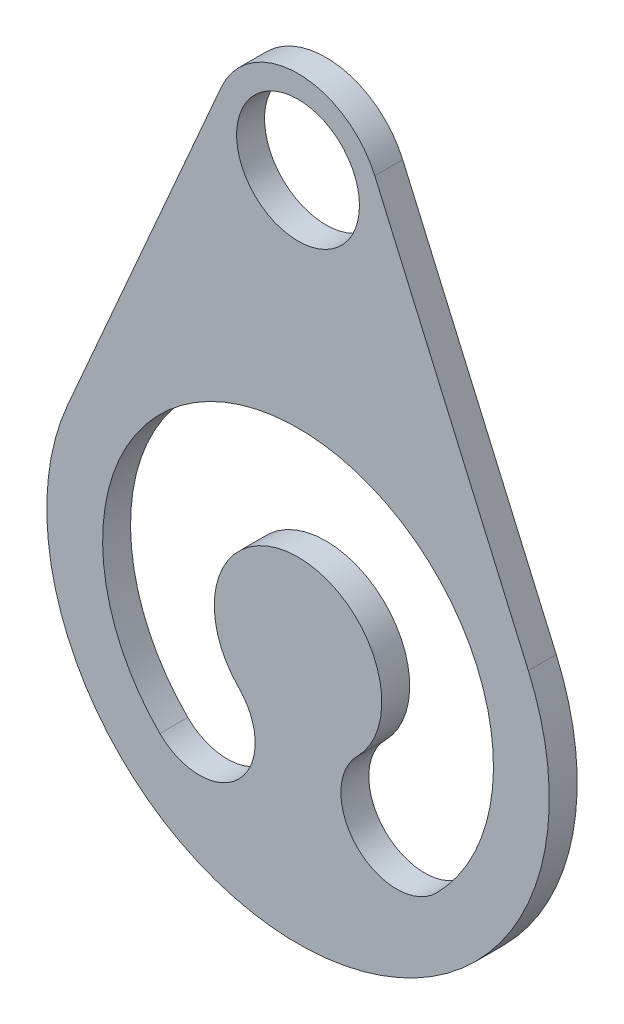
ISO-10303-21;
HEADER;
FILE_DESCRIPTION(('STEP AP214'),'2;1');
FILE_NAME('part.step','',(''),(''),'','','');
FILE_SCHEMA(('AUTOMOTIVE_DESIGN { 1 0 10303 214 1 1 1 1 }'));
ENDSEC;
DATA;
#1=APPLICATION_CONTEXT('core data for automotive mechanical design processes');
#2=APPLICATION_PROTOCOL_DEFINITION('international standard','automotive_design',2000,#1);
#3=PRODUCT_CONTEXT('',#1,'mechanical');
#4=PRODUCT('Part','Part','',(#3));
#5=PRODUCT_RELATED_PRODUCT_CATEGORY('part','',(#4));
#6=PRODUCT_DEFINITION_FORMATION('','',#4);
#7=PRODUCT_DEFINITION_CONTEXT('part definition',#1,'design');
#8=PRODUCT_DEFINITION('design','',#6,#7);
#9=PRODUCT_DEFINITION_SHAPE('','',#8);
#10=(LENGTH_UNIT() NAMED_UNIT(*) SI_UNIT(.MILLI.,.METRE.));
#11=(NAMED_UNIT(*) PLANE_ANGLE_UNIT() SI_UNIT($,.RADIAN.));
#12=(NAMED_UNIT(*) SI_UNIT($,.STERADIAN.) SOLID_ANGLE_UNIT());
#13=UNCERTAINTY_MEASURE_WITH_UNIT(LENGTH_MEASURE(1.E-05),#10,'distance_accuracy_value','');
#14=(GEOMETRIC_REPRESENTATION_CONTEXT(3) GLOBAL_UNCERTAINTY_ASSIGNED_CONTEXT((#13)) GLOBAL_UNIT_ASSIGNED_CONTEXT((#10,
#11,#12)) REPRESENTATION_CONTEXT('',''));
#15=CARTESIAN_POINT('',(0.,0.,0.));
#16=DIRECTION('',(0.,0.,1.));
#17=DIRECTION('',(1.,0.,0.));
#18=AXIS2_PLACEMENT_3D('',#15,#16,#17);
#19=CARTESIAN_POINT('',(0.,75.,5.));
#20=DIRECTION('',(0.,0.,1.));
#21=DIRECTION('',(1.,0.,0.));
#22=AXIS2_PLACEMENT_3D('',#19,#20,#21);
#23=PLANE('',#22);
#24=CARTESIAN_POINT('',(0.,0.,5.));
#25=DIRECTION('',(0.,0.,1.));
#26=DIRECTION('',(1.,0.,0.));
#27=AXIS2_PLACEMENT_3D('',#24,#25,#26);
#28=CIRCLE('',#27,35.);
#29=CARTESIAN_POINT('',(24.7487373415292,-24.7487373415292,5.));
#30=VERTEX_POINT('',#29);
#31=CARTESIAN_POINT('',(-24.7487373415291,-24.7487373415292,5.));
#32=VERTEX_POINT('',#31);
#33=EDGE_CURVE('E106',#30,#32,#28,.T.);
#34=ORIENTED_EDGE('',*,*,#33,.F.);
#35=CARTESIAN_POINT('',(17.6776695296637,-17.6776695296637,5.));
#36=DIRECTION('',(0.,0.,1.));
#37=DIRECTION('',(1.,0.,0.));
#38=AXIS2_PLACEMENT_3D('',#35,#36,#37);
#39=CIRCLE('',#38,10.);
#40=CARTESIAN_POINT('',(10.6066017177982,-10.6066017177982,5.));
#41=VERTEX_POINT('',#40);
#42=EDGE_CURVE('E98',#41,#30,#39,.T.);
#43=ORIENTED_EDGE('',*,*,#42,.F.);
#44=CARTESIAN_POINT('',(0.,0.,5.));
#45=DIRECTION('',(0.,0.,-1.));
#46=DIRECTION('',(1.,0.,0.));
#47=AXIS2_PLACEMENT_3D('',#44,#45,#46);
#48=CIRCLE('',#47,15.);
#49=CARTESIAN_POINT('',(-10.6066017177982,-10.6066017177982,5.));
#50=VERTEX_POINT('',#49);
#51=EDGE_CURVE('E121',#50,#41,#48,.T.);
#52=ORIENTED_EDGE('',*,*,#51,.F.);
#53=CARTESIAN_POINT('',(-17.6776695296637,-17.6776695296637,5.));
#54=DIRECTION('',(0.,0.,1.));
#55=DIRECTION('',(1.,0.,0.));
#56=AXIS2_PLACEMENT_3D('',#53,#54,#55);
#57=CIRCLE('',#56,10.);
#58=EDGE_CURVE('E119',#32,#50,#57,.T.);
#59=ORIENTED_EDGE('',*,*,#58,.F.);
#60=EDGE_LOOP('',(#34,#43,#52,#59));
#61=FACE_BOUND('',#60,.T.);
#62=CARTESIAN_POINT('',(0.,75.,5.));
#63=DIRECTION('',(0.,0.,1.));
#64=DIRECTION('',(1.,0.,0.));
#65=AXIS2_PLACEMENT_3D('',#62,#63,#64);
#66=CIRCLE('',#65,15.);
#67=CARTESIAN_POINT('',(13.7477270848675,81.,5.));
#68=VERTEX_POINT('',#67);
#69=CARTESIAN_POINT('',(-13.7477270848675,81.,5.));
#70=VERTEX_POINT('',#69);
#71=EDGE_CURVE('E137',#68,#70,#66,.T.);
#72=ORIENTED_EDGE('',*,*,#71,.T.);
#73=DIRECTION('',(-0.4,-0.916515138991168,0.));
#74=VECTOR('',#73,1.);
#75=CARTESIAN_POINT('',(-13.7477270848675,81.,5.));
#76=LINE('',#75,#74);
#77=CARTESIAN_POINT('',(-41.2431812546026,18.,5.));
#78=VERTEX_POINT('',#77);
#79=EDGE_CURVE('E140',#70,#78,#76,.T.);
#80=ORIENTED_EDGE('',*,*,#79,.T.);
#81=CARTESIAN_POINT('',(0.,0.,5.));
#82=DIRECTION('',(0.,0.,1.));
#83=DIRECTION('',(1.,0.,0.));
#84=AXIS2_PLACEMENT_3D('',#81,#82,#83);
#85=CIRCLE('',#84,45.);
#86=CARTESIAN_POINT('',(41.2431812546026,18.,5.));
#87=VERTEX_POINT('',#86);
#88=EDGE_CURVE('E143',#78,#87,#85,.T.);
#89=ORIENTED_EDGE('',*,*,#88,.T.);
#90=DIRECTION('',(-0.4,0.916515138991168,0.));
#91=VECTOR('',#90,1.);
#92=CARTESIAN_POINT('',(13.7477270848675,81.,5.));
#93=LINE('',#92,#91);
#94=EDGE_CURVE('E145',#87,#68,#93,.T.);
#95=ORIENTED_EDGE('',*,*,#94,.T.);
#96=EDGE_LOOP('',(#72,#80,#89,#95));
#97=FACE_BOUND('',#96,.T.);
#98=CARTESIAN_POINT('',(0.,75.,5.));
#99=DIRECTION('',(0.,0.,1.));
#100=DIRECTION('',(1.,0.,0.));
#101=AXIS2_PLACEMENT_3D('',#98,#99,#100);
#102=CIRCLE('',#101,11.);
#103=CARTESIAN_POINT('',(11.,75.,5.));
#104=VERTEX_POINT('',#103);
#105=EDGE_CURVE('E127',#104,#104,#102,.T.);
#106=ORIENTED_EDGE('',*,*,#105,.F.);
#107=EDGE_LOOP('',(#106));
#108=FACE_BOUND('',#107,.T.);
#109=ADVANCED_FACE('F33',(#61,#97,#108),#23,.T.);
#110=CARTESIAN_POINT('',(0.,75.,0.));
#111=DIRECTION('',(0.,0.,1.));
#112=DIRECTION('',(1.,0.,0.));
#113=AXIS2_PLACEMENT_3D('',#110,#111,#112);
#114=PLANE('',#113);
#115=CARTESIAN_POINT('',(0.,75.,0.));
#116=DIRECTION('',(0.,0.,1.));
#117=DIRECTION('',(1.,0.,0.));
#118=AXIS2_PLACEMENT_3D('',#115,#116,#117);
#119=CIRCLE('',#118,15.);
#120=CARTESIAN_POINT('',(13.7477270848675,81.,0.));
#121=VERTEX_POINT('',#120);
#122=CARTESIAN_POINT('',(-13.7477270848675,81.,0.));
#123=VERTEX_POINT('',#122);
#124=EDGE_CURVE('E114',#121,#123,#119,.T.);
#125=ORIENTED_EDGE('',*,*,#124,.F.);
#126=DIRECTION('',(-0.4,0.916515138991168,0.));
#127=VECTOR('',#126,1.);
#128=CARTESIAN_POINT('',(13.7477270848675,81.,0.));
#129=LINE('',#128,#127);
#130=CARTESIAN_POINT('',(41.2431812546026,18.,0.));
#131=VERTEX_POINT('',#130);
#132=EDGE_CURVE('E141',#131,#121,#129,.T.);
#133=ORIENTED_EDGE('',*,*,#132,.F.);
#134=CARTESIAN_POINT('',(0.,0.,0.));
#135=DIRECTION('',(0.,0.,1.));
#136=DIRECTION('',(1.,0.,0.));
#137=AXIS2_PLACEMENT_3D('',#134,#135,#136);
#138=CIRCLE('',#137,45.);
#139=CARTESIAN_POINT('',(-41.2431812546026,18.,0.));
#140=VERTEX_POINT('',#139);
#141=EDGE_CURVE('E152',#140,#131,#138,.T.);
#142=ORIENTED_EDGE('',*,*,#141,.F.);
#143=DIRECTION('',(-0.4,-0.916515138991168,0.));
#144=VECTOR('',#143,1.);
#145=CARTESIAN_POINT('',(-13.7477270848675,81.,0.));
#146=LINE('',#145,#144);
#147=EDGE_CURVE('E150',#123,#140,#146,.T.);
#148=ORIENTED_EDGE('',*,*,#147,.F.);
#149=EDGE_LOOP('',(#125,#133,#142,#148));
#150=FACE_BOUND('',#149,.T.);
#151=CARTESIAN_POINT('',(17.6776695296637,-17.6776695296637,0.));
#152=DIRECTION('',(0.,0.,1.));
#153=DIRECTION('',(1.,0.,0.));
#154=AXIS2_PLACEMENT_3D('',#151,#152,#153);
#155=CIRCLE('',#154,10.);
#156=CARTESIAN_POINT('',(10.6066017177982,-10.6066017177982,0.));
#157=VERTEX_POINT('',#156);
#158=CARTESIAN_POINT('',(24.7487373415292,-24.7487373415292,0.));
#159=VERTEX_POINT('',#158);
#160=EDGE_CURVE('E56',#157,#159,#155,.T.);
#161=ORIENTED_EDGE('',*,*,#160,.T.);
#162=CARTESIAN_POINT('',(0.,0.,0.));
#163=DIRECTION('',(0.,0.,1.));
#164=DIRECTION('',(1.,0.,0.));
#165=AXIS2_PLACEMENT_3D('',#162,#163,#164);
#166=CIRCLE('',#165,35.);
#167=CARTESIAN_POINT('',(-24.7487373415291,-24.7487373415292,0.));
#168=VERTEX_POINT('',#167);
#169=EDGE_CURVE('E113',#159,#168,#166,.T.);
#170=ORIENTED_EDGE('',*,*,#169,.T.);
#171=CARTESIAN_POINT('',(-17.6776695296637,-17.6776695296637,0.));
#172=DIRECTION('',(0.,0.,1.));
#173=DIRECTION('',(1.,0.,0.));
#174=AXIS2_PLACEMENT_3D('',#171,#172,#173);
#175=CIRCLE('',#174,10.);
#176=CARTESIAN_POINT('',(-10.6066017177982,-10.6066017177982,0.));
#177=VERTEX_POINT('',#176);
#178=EDGE_CURVE('E129',#168,#177,#175,.T.);
#179=ORIENTED_EDGE('',*,*,#178,.T.);
#180=CARTESIAN_POINT('',(0.,0.,0.));
#181=DIRECTION('',(0.,0.,-1.));
#182=DIRECTION('',(1.,0.,0.));
#183=AXIS2_PLACEMENT_3D('',#180,#181,#182);
#184=CIRCLE('',#183,15.);
#185=EDGE_CURVE('E107',#177,#157,#184,.T.);
#186=ORIENTED_EDGE('',*,*,#185,.T.);
#187=EDGE_LOOP('',(#161,#170,#179,#186));
#188=FACE_BOUND('',#187,.T.);
#189=CARTESIAN_POINT('',(0.,75.,0.));
#190=DIRECTION('',(0.,0.,1.));
#191=DIRECTION('',(1.,0.,0.));
#192=AXIS2_PLACEMENT_3D('',#189,#190,#191);
#193=CIRCLE('',#192,11.);
#194=CARTESIAN_POINT('',(11.,75.,0.));
#195=VERTEX_POINT('',#194);
#196=EDGE_CURVE('E223',#195,#195,#193,.T.);
#197=ORIENTED_EDGE('',*,*,#196,.T.);
#198=EDGE_LOOP('',(#197));
#199=FACE_BOUND('',#198,.T.);
#200=ADVANCED_FACE('F170',(#150,#188,#199),#114,.F.);
#201=CARTESIAN_POINT('',(0.,75.,5.));
#202=DIRECTION('',(0.,0.,-1.));
#203=DIRECTION('',(-1.,0.,0.));
#204=AXIS2_PLACEMENT_3D('',#201,#202,#203);
#205=CYLINDRICAL_SURFACE('',#204,15.);
#206=ORIENTED_EDGE('',*,*,#124,.T.);
#207=DIRECTION('',(0.,0.,-1.));
#208=VECTOR('',#207,1.);
#209=CARTESIAN_POINT('',(-13.7477270848675,81.,5.));
#210=LINE('',#209,#208);
#211=EDGE_CURVE('E11',#70,#123,#210,.T.);
#212=ORIENTED_EDGE('',*,*,#211,.F.);
#213=ORIENTED_EDGE('',*,*,#71,.F.);
#214=DIRECTION('',(0.,0.,-1.));
#215=VECTOR('',#214,1.);
#216=CARTESIAN_POINT('',(13.7477270848675,81.,5.));
#217=LINE('',#216,#215);
#218=EDGE_CURVE('E147',#68,#121,#217,.T.);
#219=ORIENTED_EDGE('',*,*,#218,.T.);
#220=EDGE_LOOP('',(#206,#212,#213,#219));
#221=FACE_BOUND('',#220,.T.);
#222=ADVANCED_FACE('F35',(#221),#205,.T.);
#223=CARTESIAN_POINT('',(-13.7477270848675,81.,5.));
#224=DIRECTION('',(0.916515138991168,-0.4,0.));
#225=DIRECTION('',(0.4,0.916515138991168,0.));
#226=AXIS2_PLACEMENT_3D('',#223,#224,#225);
#227=PLANE('',#226);
#228=ORIENTED_EDGE('',*,*,#147,.T.);
#229=DIRECTION('',(0.,0.,-1.));
#230=VECTOR('',#229,1.);
#231=CARTESIAN_POINT('',(-41.2431812546026,18.,5.));
#232=LINE('',#231,#230);
#233=EDGE_CURVE('E41',#78,#140,#232,.T.);
#234=ORIENTED_EDGE('',*,*,#233,.F.);
#235=ORIENTED_EDGE('',*,*,#79,.F.);
#236=ORIENTED_EDGE('',*,*,#211,.T.);
#237=EDGE_LOOP('',(#228,#234,#235,#236));
#238=FACE_BOUND('',#237,.T.);
#239=ADVANCED_FACE('F180',(#238),#227,.F.);
#240=CARTESIAN_POINT('',(0.,0.,5.));
#241=DIRECTION('',(0.,0.,-1.));
#242=DIRECTION('',(-1.,0.,0.));
#243=AXIS2_PLACEMENT_3D('',#240,#241,#242);
#244=CYLINDRICAL_SURFACE('',#243,45.);
#245=ORIENTED_EDGE('',*,*,#141,.T.);
#246=DIRECTION('',(0.,0.,-1.));
#247=VECTOR('',#246,1.);
#248=CARTESIAN_POINT('',(41.2431812546026,18.,5.));
#249=LINE('',#248,#247);
#250=EDGE_CURVE('E157',#87,#131,#249,.T.);
#251=ORIENTED_EDGE('',*,*,#250,.F.);
#252=ORIENTED_EDGE('',*,*,#88,.F.);
#253=ORIENTED_EDGE('',*,*,#233,.T.);
#254=EDGE_LOOP('',(#245,#251,#252,#253));
#255=FACE_BOUND('',#254,.T.);
#256=ADVANCED_FACE('F164',(#255),#244,.T.);
#257=CARTESIAN_POINT('',(13.7477270848675,81.,5.));
#258=DIRECTION('',(-0.916515138991168,-0.4,0.));
#259=DIRECTION('',(0.4,-0.916515138991168,0.));
#260=AXIS2_PLACEMENT_3D('',#257,#258,#259);
#261=PLANE('',#260);
#262=ORIENTED_EDGE('',*,*,#132,.T.);
#263=ORIENTED_EDGE('',*,*,#218,.F.);
#264=ORIENTED_EDGE('',*,*,#94,.F.);
#265=ORIENTED_EDGE('',*,*,#250,.T.);
#266=EDGE_LOOP('',(#262,#263,#264,#265));
#267=FACE_BOUND('',#266,.T.);
#268=ADVANCED_FACE('F174',(#267),#261,.F.);
#269=CARTESIAN_POINT('',(17.6776695296637,-17.6776695296637,5.));
#270=DIRECTION('',(0.,0.,-1.));
#271=DIRECTION('',(-1.,0.,0.));
#272=AXIS2_PLACEMENT_3D('',#269,#270,#271);
#273=CYLINDRICAL_SURFACE('',#272,10.);
#274=ORIENTED_EDGE('',*,*,#160,.F.);
#275=DIRECTION('',(0.,0.,-1.));
#276=VECTOR('',#275,1.);
#277=CARTESIAN_POINT('',(10.6066017177982,-10.6066017177982,5.));
#278=LINE('',#277,#276);
#279=EDGE_CURVE('E102',#41,#157,#278,.T.);
#280=ORIENTED_EDGE('',*,*,#279,.F.);
#281=ORIENTED_EDGE('',*,*,#42,.T.);
#282=DIRECTION('',(0.,0.,-1.));
#283=VECTOR('',#282,1.);
#284=CARTESIAN_POINT('',(24.7487373415292,-24.7487373415292,5.));
#285=LINE('',#284,#283);
#286=EDGE_CURVE('E101',#30,#159,#285,.T.);
#287=ORIENTED_EDGE('',*,*,#286,.T.);
#288=EDGE_LOOP('',(#274,#280,#281,#287));
#289=FACE_BOUND('',#288,.T.);
#290=ADVANCED_FACE('F100',(#289),#273,.F.);
#291=CARTESIAN_POINT('',(0.,0.,5.));
#292=DIRECTION('',(0.,0.,-1.));
#293=DIRECTION('',(-1.,0.,0.));
#294=AXIS2_PLACEMENT_3D('',#291,#292,#293);
#295=CYLINDRICAL_SURFACE('',#294,35.);
#296=ORIENTED_EDGE('',*,*,#169,.F.);
#297=ORIENTED_EDGE('',*,*,#286,.F.);
#298=ORIENTED_EDGE('',*,*,#33,.T.);
#299=DIRECTION('',(0.,0.,-1.));
#300=VECTOR('',#299,1.);
#301=CARTESIAN_POINT('',(-24.7487373415291,-24.7487373415292,5.));
#302=LINE('',#301,#300);
#303=EDGE_CURVE('E115',#32,#168,#302,.T.);
#304=ORIENTED_EDGE('',*,*,#303,.T.);
#305=EDGE_LOOP('',(#296,#297,#298,#304));
#306=FACE_BOUND('',#305,.T.);
#307=ADVANCED_FACE('F110',(#306),#295,.F.);
#308=CARTESIAN_POINT('',(-17.6776695296637,-17.6776695296637,5.));
#309=DIRECTION('',(0.,0.,-1.));
#310=DIRECTION('',(-1.,0.,0.));
#311=AXIS2_PLACEMENT_3D('',#308,#309,#310);
#312=CYLINDRICAL_SURFACE('',#311,10.);
#313=ORIENTED_EDGE('',*,*,#178,.F.);
#314=ORIENTED_EDGE('',*,*,#303,.F.);
#315=ORIENTED_EDGE('',*,*,#58,.T.);
#316=DIRECTION('',(0.,0.,-1.));
#317=VECTOR('',#316,1.);
#318=CARTESIAN_POINT('',(-10.6066017177982,-10.6066017177982,5.));
#319=LINE('',#318,#317);
#320=EDGE_CURVE('E48',#50,#177,#319,.T.);
#321=ORIENTED_EDGE('',*,*,#320,.T.);
#322=EDGE_LOOP('',(#313,#314,#315,#321));
#323=FACE_BOUND('',#322,.T.);
#324=ADVANCED_FACE('F203',(#323),#312,.F.);
#325=CARTESIAN_POINT('',(0.,0.,5.));
#326=DIRECTION('',(0.,0.,-1.));
#327=DIRECTION('',(-1.,0.,0.));
#328=AXIS2_PLACEMENT_3D('',#325,#326,#327);
#329=CYLINDRICAL_SURFACE('',#328,15.);
#330=ORIENTED_EDGE('',*,*,#185,.F.);
#331=ORIENTED_EDGE('',*,*,#320,.F.);
#332=ORIENTED_EDGE('',*,*,#51,.T.);
#333=ORIENTED_EDGE('',*,*,#279,.T.);
#334=EDGE_LOOP('',(#330,#331,#332,#333));
#335=FACE_BOUND('',#334,.T.);
#336=ADVANCED_FACE('F207',(#335),#329,.T.);
#337=CARTESIAN_POINT('',(0.,75.,5.));
#338=DIRECTION('',(0.,0.,-1.));
#339=DIRECTION('',(-1.,0.,0.));
#340=AXIS2_PLACEMENT_3D('',#337,#338,#339);
#341=CYLINDRICAL_SURFACE('',#340,11.);
#342=ORIENTED_EDGE('',*,*,#105,.T.);
#343=EDGE_LOOP('',(#342));
#344=FACE_BOUND('',#343,.T.);
#345=ORIENTED_EDGE('',*,*,#196,.F.);
#346=EDGE_LOOP('',(#345));
#347=FACE_BOUND('',#346,.T.);
#348=ADVANCED_FACE('F213',(#344,#347),#341,.F.);
#349=CLOSED_SHELL('',(#109,#200,#222,#239,#256,#268,#290,#307,#324,#336,#348));
#350=MANIFOLD_SOLID_BREP('B2',#349);
#351=ADVANCED_BREP_SHAPE_REPRESENTATION('',(#18,#350),#14);
#352=SHAPE_DEFINITION_REPRESENTATION(#9,#351);
ENDSEC;
END-ISO-10303-21;
